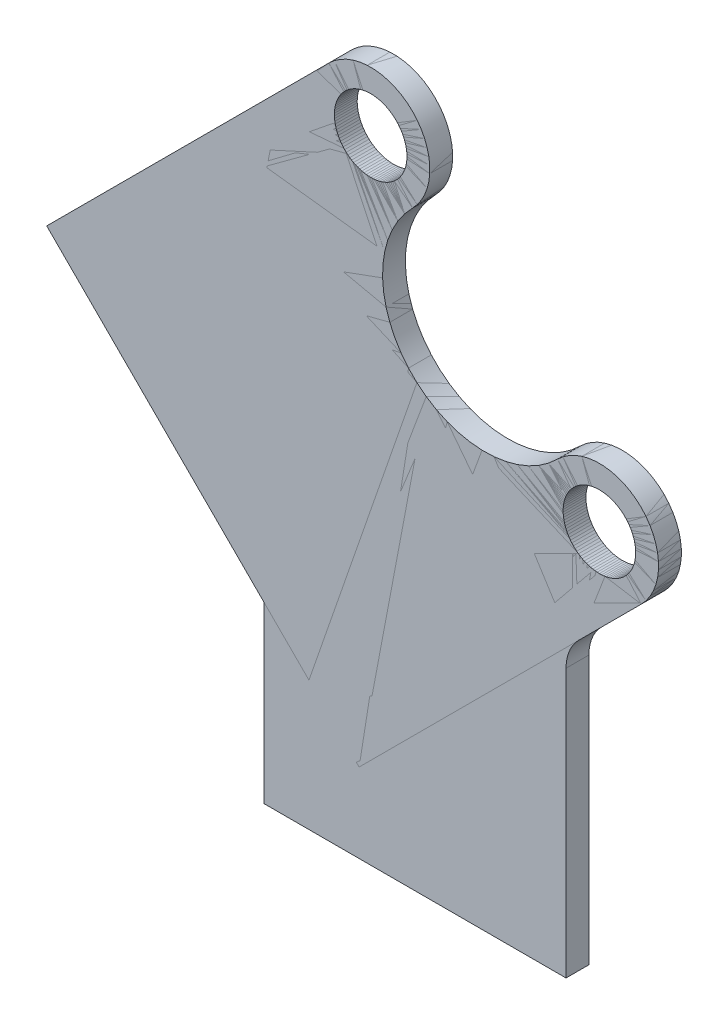
ISO-10303-21;
HEADER;
FILE_DESCRIPTION(('STEP AP214'),'2;1');
FILE_NAME('part.step','',(''),(''),'','','');
FILE_SCHEMA(('AUTOMOTIVE_DESIGN { 1 0 10303 214 1 1 1 1 }'));
ENDSEC;
DATA;
#1=APPLICATION_CONTEXT('core data for automotive mechanical design processes');
#2=APPLICATION_PROTOCOL_DEFINITION('international standard','automotive_design',2000,#1);
#3=PRODUCT_CONTEXT('',#1,'mechanical');
#4=PRODUCT('Part','Part','',(#3));
#5=PRODUCT_RELATED_PRODUCT_CATEGORY('part','',(#4));
#6=PRODUCT_DEFINITION_FORMATION('','',#4);
#7=PRODUCT_DEFINITION_CONTEXT('part definition',#1,'design');
#8=PRODUCT_DEFINITION('design','',#6,#7);
#9=PRODUCT_DEFINITION_SHAPE('','',#8);
#10=(LENGTH_UNIT() NAMED_UNIT(*) SI_UNIT(.MILLI.,.METRE.));
#11=(NAMED_UNIT(*) PLANE_ANGLE_UNIT() SI_UNIT($,.RADIAN.));
#12=(NAMED_UNIT(*) SI_UNIT($,.STERADIAN.) SOLID_ANGLE_UNIT());
#13=UNCERTAINTY_MEASURE_WITH_UNIT(LENGTH_MEASURE(1.E-05),#10,'distance_accuracy_value','');
#14=(GEOMETRIC_REPRESENTATION_CONTEXT(3) GLOBAL_UNCERTAINTY_ASSIGNED_CONTEXT((#13)) GLOBAL_UNIT_ASSIGNED_CONTEXT((#10,
#11,#12)) REPRESENTATION_CONTEXT('',''));
#15=CARTESIAN_POINT('',(0.,0.,0.));
#16=DIRECTION('',(0.,0.,1.));
#17=DIRECTION('',(1.,0.,0.));
#18=AXIS2_PLACEMENT_3D('',#15,#16,#17);
#19=CARTESIAN_POINT('',(29.0374401135023,50.8750901135023,0.));
#20=DIRECTION('',(0.,0.,1.));
#21=DIRECTION('',(1.,0.,0.));
#22=AXIS2_PLACEMENT_3D('',#19,#20,#21);
#23=PLANE('',#22);
#24=CARTESIAN_POINT('',(49.3626802270047,59.3620197729953,0.));
#25=DIRECTION('',(0.,0.,-1.));
#26=DIRECTION('',(1.,0.,0.));
#27=AXIS2_PLACEMENT_3D('',#24,#25,#26);
#28=CIRCLE('',#27,5.3467);
#29=CARTESIAN_POINT('',(54.7093802270047,59.3620197729953,0.));
#30=VERTEX_POINT('',#29);
#31=EDGE_CURVE('P0_E146',#30,#30,#28,.T.);
#32=ORIENTED_EDGE('',*,*,#31,.F.);
#33=EDGE_LOOP('',(#32));
#34=FACE_BOUND('',#33,.T.);
#35=CARTESIAN_POINT('',(15.6867197729953,93.0379802270047,0.));
#36=DIRECTION('',(0.,0.,-1.));
#37=DIRECTION('',(1.,0.,0.));
#38=AXIS2_PLACEMENT_3D('',#35,#36,#37);
#39=CIRCLE('',#38,5.3467);
#40=CARTESIAN_POINT('',(21.0334197729953,93.0379802270047,0.));
#41=VERTEX_POINT('',#40);
#42=EDGE_CURVE('P0_E147',#41,#41,#39,.T.);
#43=ORIENTED_EDGE('',*,*,#42,.F.);
#44=EDGE_LOOP('',(#43));
#45=FACE_BOUND('',#44,.T.);
#46=DIRECTION('',(-0.707106781186547,-0.707106781186547,0.));
#47=VECTOR('',#46,1.);
#48=CARTESIAN_POINT('',(55.5231359260591,53.2015640739429,0.));
#49=LINE('',#48,#47);
#50=CARTESIAN_POINT('',(55.5231359260586,53.2015640739424,0.));
#51=VERTEX_POINT('',#50);
#52=CARTESIAN_POINT('',(13.9879995839359,11.6664277318199,0.));
#53=VERTEX_POINT('',#52);
#54=EDGE_CURVE('P0_E42',#51,#53,#49,.T.);
#55=ORIENTED_EDGE('',*,*,#54,.T.);
#56=DIRECTION('',(0.707106781186545,-0.70710678118655,0.));
#57=VECTOR('',#56,1.);
#58=CARTESIAN_POINT('',(-32.0088722681802,57.6632995839363,0.));
#59=LINE('',#58,#57);
#60=CARTESIAN_POINT('',(-32.0088722681802,57.6632995839363,0.));
#61=VERTEX_POINT('',#60);
#62=EDGE_CURVE('P0_E132',#61,#53,#59,.T.);
#63=ORIENTED_EDGE('',*,*,#62,.F.);
#64=DIRECTION('',(-0.70710678118655,-0.707106781186545,0.));
#65=VECTOR('',#64,1.);
#66=CARTESIAN_POINT('',(9.5262640739417,99.1984359260579,0.));
#67=LINE('',#66,#65);
#68=CARTESIAN_POINT('',(9.5262640739417,99.1984359260579,0.));
#69=VERTEX_POINT('',#68);
#70=EDGE_CURVE('P0_E136',#69,#61,#67,.T.);
#71=ORIENTED_EDGE('',*,*,#70,.F.);
#72=CARTESIAN_POINT('',(15.6867197729953,93.0379802270047,0.));
#73=DIRECTION('',(0.,0.,1.));
#74=DIRECTION('',(1.,0.,0.));
#75=AXIS2_PLACEMENT_3D('',#72,#73,#74);
#76=CIRCLE('',#75,8.7122);
#77=CARTESIAN_POINT('',(21.8471754720488,86.8775245279512,0.));
#78=VERTEX_POINT('',#77);
#79=EDGE_CURVE('P0_E150',#78,#69,#76,.T.);
#80=ORIENTED_EDGE('',*,*,#79,.F.);
#81=DIRECTION('',(0.707106781186548,-0.707106781186547,0.));
#82=VECTOR('',#81,1.);
#83=CARTESIAN_POINT('',(15.6867197729953,93.0379802270047,0.));
#84=LINE('',#83,#82);
#85=CARTESIAN_POINT('',(21.8561557281698,86.8685442718302,0.));
#86=VERTEX_POINT('',#85);
#87=EDGE_CURVE('P0_E158',#78,#86,#84,.T.);
#88=ORIENTED_EDGE('',*,*,#87,.T.);
#89=CARTESIAN_POINT('',(32.5247,76.2,0.));
#90=DIRECTION('',(0.,0.,1.));
#91=DIRECTION('',(1.,0.,0.));
#92=AXIS2_PLACEMENT_3D('',#89,#90,#91);
#93=CIRCLE('',#92,15.0876);
#94=CARTESIAN_POINT('',(43.1932442718302,65.5314557281699,0.));
#95=VERTEX_POINT('',#94);
#96=EDGE_CURVE('P0_E153',#86,#95,#93,.T.);
#97=ORIENTED_EDGE('',*,*,#96,.T.);
#98=DIRECTION('',(0.707106781186548,-0.707106781186547,0.));
#99=VECTOR('',#98,1.);
#100=CARTESIAN_POINT('',(15.6867197729953,93.0379802270047,0.));
#101=LINE('',#100,#99);
#102=CARTESIAN_POINT('',(43.2022245279513,65.5224754720488,0.));
#103=VERTEX_POINT('',#102);
#104=EDGE_CURVE('P0_E75',#95,#103,#101,.T.);
#105=ORIENTED_EDGE('',*,*,#104,.T.);
#106=CARTESIAN_POINT('',(49.3626802270047,59.3620197729953,0.));
#107=DIRECTION('',(0.,0.,1.));
#108=DIRECTION('',(1.,0.,0.));
#109=AXIS2_PLACEMENT_3D('',#106,#107,#108);
#110=CIRCLE('',#109,8.7122);
#111=EDGE_CURVE('P0_E48',#51,#103,#110,.T.);
#112=ORIENTED_EDGE('',*,*,#111,.F.);
#113=EDGE_LOOP('',(#55,#63,#71,#80,#88,#97,#105,#112));
#114=FACE_BOUND('',#113,.T.);
#115=ADVANCED_FACE('P0_F39',(#34,#45,#114),#23,.F.);
#116=CARTESIAN_POINT('',(29.0374401135023,50.8750901135023,3.36));
#117=DIRECTION('',(0.,0.,1.));
#118=DIRECTION('',(1.,0.,0.));
#119=AXIS2_PLACEMENT_3D('',#116,#117,#118);
#120=PLANE('',#119);
#121=CARTESIAN_POINT('',(15.6867197729953,93.0379802270047,3.36));
#122=DIRECTION('',(0.,0.,-1.));
#123=DIRECTION('',(1.,0.,0.));
#124=AXIS2_PLACEMENT_3D('',#121,#122,#123);
#125=CIRCLE('',#124,5.3467);
#126=CARTESIAN_POINT('',(21.0334197729953,93.0379802270047,3.36));
#127=VERTEX_POINT('',#126);
#128=EDGE_CURVE('P0_E141',#127,#127,#125,.T.);
#129=ORIENTED_EDGE('',*,*,#128,.T.);
#130=EDGE_LOOP('',(#129));
#131=FACE_BOUND('',#130,.T.);
#132=CARTESIAN_POINT('',(49.3626802270047,59.3620197729953,3.36));
#133=DIRECTION('',(0.,0.,-1.));
#134=DIRECTION('',(1.,0.,0.));
#135=AXIS2_PLACEMENT_3D('',#132,#133,#134);
#136=CIRCLE('',#135,5.3467);
#137=CARTESIAN_POINT('',(54.7093802270047,59.3620197729953,3.36));
#138=VERTEX_POINT('',#137);
#139=EDGE_CURVE('P0_E143',#138,#138,#136,.T.);
#140=ORIENTED_EDGE('',*,*,#139,.T.);
#141=EDGE_LOOP('',(#140));
#142=FACE_BOUND('',#141,.T.);
#143=DIRECTION('',(0.707106781186545,-0.70710678118655,0.));
#144=VECTOR('',#143,1.);
#145=CARTESIAN_POINT('',(-32.0088722681802,57.6632995839363,3.36));
#146=LINE('',#145,#144);
#147=CARTESIAN_POINT('',(-32.0088722681802,57.6632995839363,3.36000000000006));
#148=VERTEX_POINT('',#147);
#149=CARTESIAN_POINT('',(13.9879995839359,11.6664277318199,3.36000000000006));
#150=VERTEX_POINT('',#149);
#151=EDGE_CURVE('P0_E108',#148,#150,#146,.T.);
#152=ORIENTED_EDGE('',*,*,#151,.T.);
#153=DIRECTION('',(0.707106781186548,0.707106781186548,0.));
#154=VECTOR('',#153,1.);
#155=CARTESIAN_POINT('',(55.5231359260581,53.2015640739419,3.36));
#156=LINE('',#155,#154);
#157=CARTESIAN_POINT('',(55.5231359260591,53.2015640739429,3.36));
#158=VERTEX_POINT('',#157);
#159=EDGE_CURVE('P0_E121',#150,#158,#156,.T.);
#160=ORIENTED_EDGE('',*,*,#159,.T.);
#161=CARTESIAN_POINT('',(49.3626802270047,59.3620197729953,3.36));
#162=DIRECTION('',(0.,0.,1.));
#163=DIRECTION('',(1.,0.,0.));
#164=AXIS2_PLACEMENT_3D('',#161,#162,#163);
#165=CIRCLE('',#164,8.7122);
#166=CARTESIAN_POINT('',(43.2022245279513,65.5224754720488,3.36));
#167=VERTEX_POINT('',#166);
#168=EDGE_CURVE('P0_E11',#158,#167,#165,.T.);
#169=ORIENTED_EDGE('',*,*,#168,.T.);
#170=DIRECTION('',(-0.707106781186548,0.707106781186547,0.));
#171=VECTOR('',#170,1.);
#172=CARTESIAN_POINT('',(15.6867197729953,93.0379802270047,3.36));
#173=LINE('',#172,#171);
#174=CARTESIAN_POINT('',(43.1932442718302,65.5314557281699,3.36));
#175=VERTEX_POINT('',#174);
#176=EDGE_CURVE('P0_E164',#167,#175,#173,.T.);
#177=ORIENTED_EDGE('',*,*,#176,.T.);
#178=CARTESIAN_POINT('',(32.5247,76.2,3.36));
#179=DIRECTION('',(0.,0.,-1.));
#180=DIRECTION('',(1.,0.,0.));
#181=AXIS2_PLACEMENT_3D('',#178,#179,#180);
#182=CIRCLE('',#181,15.0876);
#183=CARTESIAN_POINT('',(21.8561557281698,86.8685442718302,3.36));
#184=VERTEX_POINT('',#183);
#185=EDGE_CURVE('P0_E80',#175,#184,#182,.T.);
#186=ORIENTED_EDGE('',*,*,#185,.T.);
#187=DIRECTION('',(-0.707106781186548,0.707106781186547,0.));
#188=VECTOR('',#187,1.);
#189=CARTESIAN_POINT('',(15.6867197729953,93.0379802270047,3.36));
#190=LINE('',#189,#188);
#191=CARTESIAN_POINT('',(21.8471754720488,86.8775245279512,3.36));
#192=VERTEX_POINT('',#191);
#193=EDGE_CURVE('P0_E157',#184,#192,#190,.T.);
#194=ORIENTED_EDGE('',*,*,#193,.T.);
#195=CARTESIAN_POINT('',(15.6867197729953,93.0379802270047,3.36));
#196=DIRECTION('',(0.,0.,1.));
#197=DIRECTION('',(1.,0.,0.));
#198=AXIS2_PLACEMENT_3D('',#195,#196,#197);
#199=CIRCLE('',#198,8.7122);
#200=CARTESIAN_POINT('',(9.5262640739417,99.1984359260579,3.36000000000006));
#201=VERTEX_POINT('',#200);
#202=EDGE_CURVE('P0_E169',#192,#201,#199,.T.);
#203=ORIENTED_EDGE('',*,*,#202,.T.);
#204=DIRECTION('',(-0.70710678118655,-0.707106781186545,0.));
#205=VECTOR('',#204,1.);
#206=CARTESIAN_POINT('',(9.5262640739417,99.1984359260579,3.36));
#207=LINE('',#206,#205);
#208=EDGE_CURVE('P0_E100',#201,#148,#207,.T.);
#209=ORIENTED_EDGE('',*,*,#208,.T.);
#210=EDGE_LOOP('',(#152,#160,#169,#177,#186,#194,#203,#209));
#211=FACE_BOUND('',#210,.T.);
#212=ADVANCED_FACE('P0_F128',(#131,#142,#211),#120,.T.);
#213=CARTESIAN_POINT('',(49.3626802270047,59.3620197729953,0.));
#214=DIRECTION('',(0.,0.,-1.));
#215=DIRECTION('',(1.,0.,0.));
#216=AXIS2_PLACEMENT_3D('',#213,#214,#215);
#217=CYLINDRICAL_SURFACE('',#216,8.7122);
#218=ORIENTED_EDGE('',*,*,#111,.T.);
#219=DIRECTION('',(0.,0.,1.));
#220=VECTOR('',#219,1.);
#221=CARTESIAN_POINT('',(43.2022245279513,65.5224754720488,0.));
#222=LINE('',#221,#220);
#223=EDGE_CURVE('P0_E166',#103,#167,#222,.T.);
#224=ORIENTED_EDGE('',*,*,#223,.T.);
#225=ORIENTED_EDGE('',*,*,#168,.F.);
#226=DIRECTION('',(0.,0.,1.));
#227=VECTOR('',#226,1.);
#228=CARTESIAN_POINT('',(55.5231359260591,53.2015640739429,0.));
#229=LINE('',#228,#227);
#230=EDGE_CURVE('P0_E125',#51,#158,#229,.T.);
#231=ORIENTED_EDGE('',*,*,#230,.F.);
#232=EDGE_LOOP('',(#218,#224,#225,#231));
#233=FACE_BOUND('',#232,.T.);
#234=ADVANCED_FACE('P0_F196',(#233),#217,.T.);
#235=CARTESIAN_POINT('',(43.2022245279513,65.5224754720488,0.));
#236=DIRECTION('',(0.707106781186547,0.707106781186548,0.));
#237=DIRECTION('',(-0.707106781186548,0.707106781186547,0.));
#238=AXIS2_PLACEMENT_3D('',#235,#236,#237);
#239=PLANE('',#238);
#240=ORIENTED_EDGE('',*,*,#104,.F.);
#241=DIRECTION('',(0.,0.,1.));
#242=VECTOR('',#241,1.);
#243=CARTESIAN_POINT('',(43.1932442718302,65.5314557281699,0.));
#244=LINE('',#243,#242);
#245=EDGE_CURVE('P0_E152',#95,#175,#244,.T.);
#246=ORIENTED_EDGE('',*,*,#245,.T.);
#247=ORIENTED_EDGE('',*,*,#176,.F.);
#248=ORIENTED_EDGE('',*,*,#223,.F.);
#249=EDGE_LOOP('',(#240,#246,#247,#248));
#250=FACE_BOUND('',#249,.T.);
#251=ADVANCED_FACE('P0_F195',(#250),#239,.T.);
#252=CARTESIAN_POINT('',(32.5247,76.2,0.));
#253=DIRECTION('',(0.,0.,-1.));
#254=DIRECTION('',(1.,0.,0.));
#255=AXIS2_PLACEMENT_3D('',#252,#253,#254);
#256=CYLINDRICAL_SURFACE('',#255,15.0876);
#257=ORIENTED_EDGE('',*,*,#96,.F.);
#258=DIRECTION('',(0.,0.,1.));
#259=VECTOR('',#258,1.);
#260=CARTESIAN_POINT('',(21.8561557281698,86.8685442718302,0.));
#261=LINE('',#260,#259);
#262=EDGE_CURVE('P0_E155',#86,#184,#261,.T.);
#263=ORIENTED_EDGE('',*,*,#262,.T.);
#264=ORIENTED_EDGE('',*,*,#185,.F.);
#265=ORIENTED_EDGE('',*,*,#245,.F.);
#266=EDGE_LOOP('',(#257,#263,#264,#265));
#267=FACE_BOUND('',#266,.T.);
#268=ADVANCED_FACE('P0_F193',(#267),#256,.F.);
#269=CARTESIAN_POINT('',(21.8561557281698,86.8685442718302,0.));
#270=DIRECTION('',(0.707106781186547,0.707106781186548,0.));
#271=DIRECTION('',(-0.707106781186548,0.707106781186547,0.));
#272=AXIS2_PLACEMENT_3D('',#269,#270,#271);
#273=PLANE('',#272);
#274=ORIENTED_EDGE('',*,*,#87,.F.);
#275=DIRECTION('',(0.,0.,1.));
#276=VECTOR('',#275,1.);
#277=CARTESIAN_POINT('',(21.8471754720488,86.8775245279512,0.));
#278=LINE('',#277,#276);
#279=EDGE_CURVE('P0_E161',#78,#192,#278,.T.);
#280=ORIENTED_EDGE('',*,*,#279,.T.);
#281=ORIENTED_EDGE('',*,*,#193,.F.);
#282=ORIENTED_EDGE('',*,*,#262,.F.);
#283=EDGE_LOOP('',(#274,#280,#281,#282));
#284=FACE_BOUND('',#283,.T.);
#285=ADVANCED_FACE('P0_F190',(#284),#273,.T.);
#286=CARTESIAN_POINT('',(15.6867197729953,93.0379802270047,0.));
#287=DIRECTION('',(0.,0.,-1.));
#288=DIRECTION('',(1.,0.,0.));
#289=AXIS2_PLACEMENT_3D('',#286,#287,#288);
#290=CYLINDRICAL_SURFACE('',#289,8.7122);
#291=ORIENTED_EDGE('',*,*,#79,.T.);
#292=DIRECTION('',(0.,0.,1.));
#293=VECTOR('',#292,1.);
#294=CARTESIAN_POINT('',(9.52626407394174,99.1984359260579,0.));
#295=LINE('',#294,#293);
#296=EDGE_CURVE('P0_E126',#69,#201,#295,.T.);
#297=ORIENTED_EDGE('',*,*,#296,.T.);
#298=ORIENTED_EDGE('',*,*,#202,.F.);
#299=ORIENTED_EDGE('',*,*,#279,.F.);
#300=EDGE_LOOP('',(#291,#297,#298,#299));
#301=FACE_BOUND('',#300,.T.);
#302=ADVANCED_FACE('P0_F186',(#301),#290,.T.);
#303=CARTESIAN_POINT('',(46.3098719394654,43.9883000873493,0.));
#304=DIRECTION('',(0.707106781186548,-0.707106781186548,0.));
#305=DIRECTION('',(0.707106781186548,0.707106781186548,0.));
#306=AXIS2_PLACEMENT_3D('',#303,#304,#305);
#307=PLANE('',#306);
#308=ORIENTED_EDGE('',*,*,#54,.F.);
#309=ORIENTED_EDGE('',*,*,#230,.T.);
#310=ORIENTED_EDGE('',*,*,#159,.F.);
#311=DIRECTION('',(0.,0.,-1.));
#312=VECTOR('',#311,1.);
#313=CARTESIAN_POINT('',(13.9879995839359,11.6664277318199,3.36000000000006));
#314=LINE('',#313,#312);
#315=EDGE_CURVE('P0_E124',#150,#53,#314,.T.);
#316=ORIENTED_EDGE('',*,*,#315,.T.);
#317=EDGE_LOOP('',(#308,#309,#310,#316));
#318=FACE_BOUND('',#317,.T.);
#319=ADVANCED_FACE('P0_F123',(#318),#307,.T.);
#320=CARTESIAN_POINT('',(49.3626802270047,59.3620197729953,0.));
#321=DIRECTION('',(0.,0.,-1.));
#322=DIRECTION('',(1.,0.,0.));
#323=AXIS2_PLACEMENT_3D('',#320,#321,#322);
#324=CYLINDRICAL_SURFACE('',#323,5.3467);
#325=ORIENTED_EDGE('',*,*,#31,.T.);
#326=EDGE_LOOP('',(#325));
#327=FACE_BOUND('',#326,.T.);
#328=ORIENTED_EDGE('',*,*,#139,.F.);
#329=EDGE_LOOP('',(#328));
#330=FACE_BOUND('',#329,.T.);
#331=ADVANCED_FACE('P0_F218',(#327,#330),#324,.F.);
#332=CARTESIAN_POINT('',(15.6867197729953,93.0379802270047,0.));
#333=DIRECTION('',(0.,0.,-1.));
#334=DIRECTION('',(1.,0.,0.));
#335=AXIS2_PLACEMENT_3D('',#332,#333,#334);
#336=CYLINDRICAL_SURFACE('',#335,5.3467);
#337=ORIENTED_EDGE('',*,*,#42,.T.);
#338=EDGE_LOOP('',(#337));
#339=FACE_BOUND('',#338,.T.);
#340=ORIENTED_EDGE('',*,*,#128,.F.);
#341=EDGE_LOOP('',(#340));
#342=FACE_BOUND('',#341,.T.);
#343=ADVANCED_FACE('P0_F215',(#339,#342),#336,.F.);
#344=CARTESIAN_POINT('',(-32.0088722681802,57.6632995839363,130.757664528152));
#345=DIRECTION('',(0.70710678118655,0.707106781186545,0.));
#346=DIRECTION('',(-0.707106781186545,0.70710678118655,0.));
#347=AXIS2_PLACEMENT_3D('',#344,#345,#346);
#348=PLANE('',#347);
#349=ORIENTED_EDGE('',*,*,#62,.T.);
#350=ORIENTED_EDGE('',*,*,#315,.F.);
#351=ORIENTED_EDGE('',*,*,#151,.F.);
#352=DIRECTION('',(0.,0.,-1.));
#353=VECTOR('',#352,1.);
#354=CARTESIAN_POINT('',(-32.0088722681802,57.6632995839363,130.757664528152));
#355=LINE('',#354,#353);
#356=EDGE_CURVE('P0_E140',#148,#61,#355,.T.);
#357=ORIENTED_EDGE('',*,*,#356,.T.);
#358=EDGE_LOOP('',(#349,#350,#351,#357));
#359=FACE_BOUND('',#358,.T.);
#360=ADVANCED_FACE('P0_F130',(#359),#348,.F.);
#361=CARTESIAN_POINT('',(9.5262640739417,99.1984359260579,130.757664528152));
#362=DIRECTION('',(0.707106781186545,-0.70710678118655,0.));
#363=DIRECTION('',(0.70710678118655,0.707106781186545,0.));
#364=AXIS2_PLACEMENT_3D('',#361,#362,#363);
#365=PLANE('',#364);
#366=ORIENTED_EDGE('',*,*,#208,.F.);
#367=ORIENTED_EDGE('',*,*,#296,.F.);
#368=ORIENTED_EDGE('',*,*,#70,.T.);
#369=ORIENTED_EDGE('',*,*,#356,.F.);
#370=EDGE_LOOP('',(#366,#367,#368,#369));
#371=FACE_BOUND('',#370,.T.);
#372=ADVANCED_FACE('P0_F265',(#371),#365,.F.);
#373=CLOSED_SHELL('',(#115,#212,#234,#251,#268,#285,#302,#319,#331,#343,#360,#372));
#374=MANIFOLD_SOLID_BREP('P0_B2',#373);
#375=CARTESIAN_POINT('',(29.0374401135023,50.8750901135023,0.));
#376=DIRECTION('',(0.,0.,1.));
#377=DIRECTION('',(1.,0.,0.));
#378=AXIS2_PLACEMENT_3D('',#375,#376,#377);
#379=PLANE('',#378);
#380=CARTESIAN_POINT('',(49.3626802270047,59.3620197729953,0.));
#381=DIRECTION('',(0.,0.,1.));
#382=DIRECTION('',(1.,0.,0.));
#383=AXIS2_PLACEMENT_3D('',#380,#381,#382);
#384=CIRCLE('',#383,8.7122);
#385=CARTESIAN_POINT('',(55.5231359260591,53.2015640739429,0.));
#386=VERTEX_POINT('',#385);
#387=CARTESIAN_POINT('',(43.2022245279513,65.5224754720488,0.));
#388=VERTEX_POINT('',#387);
#389=EDGE_CURVE('P1_E27',#386,#388,#384,.T.);
#390=ORIENTED_EDGE('',*,*,#389,.F.);
#391=DIRECTION('',(-0.707106781186548,-0.707106781186548,0.));
#392=VECTOR('',#391,1.);
#393=CARTESIAN_POINT('',(55.5231359260581,53.2015640739419,0.));
#394=LINE('',#393,#392);
#395=CARTESIAN_POINT('',(46.3098719394654,43.9883000873493,0.));
#396=VERTEX_POINT('',#395);
#397=EDGE_CURVE('P1_E147',#386,#396,#394,.T.);
#398=ORIENTED_EDGE('',*,*,#397,.T.);
#399=CARTESIAN_POINT('',(50.8,39.4981720268146,0.));
#400=DIRECTION('',(0.,0.,1.));
#401=DIRECTION('',(-0.70710678118655,0.707106781186545,0.));
#402=AXIS2_PLACEMENT_3D('',#399,#400,#401);
#403=CIRCLE('',#402,6.3500000000001);
#404=CARTESIAN_POINT('',(44.45,39.4981720268146,0.));
#405=VERTEX_POINT('',#404);
#406=EDGE_CURVE('P1_E167',#396,#405,#403,.T.);
#407=ORIENTED_EDGE('',*,*,#406,.T.);
#408=DIRECTION('',(0.,-1.,0.));
#409=VECTOR('',#408,1.);
#410=CARTESIAN_POINT('',(44.45,39.4981720268146,0.));
#411=LINE('',#410,#409);
#412=CARTESIAN_POINT('',(44.45,0.,0.));
#413=VERTEX_POINT('',#412);
#414=EDGE_CURVE('P1_E110',#405,#413,#411,.T.);
#415=ORIENTED_EDGE('',*,*,#414,.T.);
#416=DIRECTION('',(1.,0.,0.));
#417=VECTOR('',#416,1.);
#418=CARTESIAN_POINT('',(0.,0.,0.));
#419=LINE('',#418,#417);
#420=CARTESIAN_POINT('',(0.,0.,0.));
#421=VERTEX_POINT('',#420);
#422=EDGE_CURVE('P1_E133',#421,#413,#419,.T.);
#423=ORIENTED_EDGE('',*,*,#422,.F.);
#424=DIRECTION('',(0.,1.,0.));
#425=VECTOR('',#424,1.);
#426=CARTESIAN_POINT('',(0.,0.,0.));
#427=LINE('',#426,#425);
#428=CARTESIAN_POINT('',(0.,76.2,0.));
#429=VERTEX_POINT('',#428);
#430=EDGE_CURVE('P1_E141',#421,#429,#427,.T.);
#431=ORIENTED_EDGE('',*,*,#430,.T.);
#432=CARTESIAN_POINT('',(32.5247,76.2,0.));
#433=DIRECTION('',(0.,0.,1.));
#434=DIRECTION('',(1.,0.,0.));
#435=AXIS2_PLACEMENT_3D('',#432,#433,#434);
#436=CIRCLE('',#435,32.5247);
#437=CARTESIAN_POINT('',(9.52626407394174,99.1984359260579,0.));
#438=VERTEX_POINT('',#437);
#439=EDGE_CURVE('P1_E179',#438,#429,#436,.T.);
#440=ORIENTED_EDGE('',*,*,#439,.F.);
#441=CARTESIAN_POINT('',(15.6867197729953,93.0379802270047,0.));
#442=DIRECTION('',(0.,0.,1.));
#443=DIRECTION('',(1.,0.,0.));
#444=AXIS2_PLACEMENT_3D('',#441,#442,#443);
#445=CIRCLE('',#444,8.7122);
#446=CARTESIAN_POINT('',(21.8471754720488,86.8775245279512,0.));
#447=VERTEX_POINT('',#446);
#448=EDGE_CURVE('P1_E81',#447,#438,#445,.T.);
#449=ORIENTED_EDGE('',*,*,#448,.F.);
#450=DIRECTION('',(0.707106781186548,-0.707106781186547,0.));
#451=VECTOR('',#450,1.);
#452=CARTESIAN_POINT('',(15.6867197729953,93.0379802270047,0.));
#453=LINE('',#452,#451);
#454=CARTESIAN_POINT('',(21.8561557281698,86.8685442718302,0.));
#455=VERTEX_POINT('',#454);
#456=EDGE_CURVE('P1_E145',#447,#455,#453,.T.);
#457=ORIENTED_EDGE('',*,*,#456,.T.);
#458=CARTESIAN_POINT('',(32.5247,76.2,0.));
#459=DIRECTION('',(0.,0.,1.));
#460=DIRECTION('',(1.,0.,0.));
#461=AXIS2_PLACEMENT_3D('',#458,#459,#460);
#462=CIRCLE('',#461,15.0876);
#463=CARTESIAN_POINT('',(43.1932442718302,65.5314557281699,0.));
#464=VERTEX_POINT('',#463);
#465=EDGE_CURVE('P1_E168',#455,#464,#462,.T.);
#466=ORIENTED_EDGE('',*,*,#465,.T.);
#467=DIRECTION('',(0.707106781186548,-0.707106781186547,0.));
#468=VECTOR('',#467,1.);
#469=CARTESIAN_POINT('',(15.6867197729953,93.0379802270047,0.));
#470=LINE('',#469,#468);
#471=EDGE_CURVE('P1_E137',#464,#388,#470,.T.);
#472=ORIENTED_EDGE('',*,*,#471,.T.);
#473=EDGE_LOOP('',(#390,#398,#407,#415,#423,#431,#440,#449,#457,#466,#472));
#474=FACE_BOUND('',#473,.T.);
#475=CARTESIAN_POINT('',(15.6867197729953,93.0379802270047,0.));
#476=DIRECTION('',(0.,0.,-1.));
#477=DIRECTION('',(1.,0.,0.));
#478=AXIS2_PLACEMENT_3D('',#475,#476,#477);
#479=CIRCLE('',#478,5.3467);
#480=CARTESIAN_POINT('',(10.3400197729953,93.0379802270047,0.));
#481=VERTEX_POINT('',#480);
#482=EDGE_CURVE('P1_E127',#481,#481,#479,.T.);
#483=ORIENTED_EDGE('',*,*,#482,.F.);
#484=EDGE_LOOP('',(#483));
#485=FACE_BOUND('',#484,.T.);
#486=CARTESIAN_POINT('',(49.3626802270047,59.3620197729953,0.));
#487=DIRECTION('',(0.,0.,-1.));
#488=DIRECTION('',(1.,0.,0.));
#489=AXIS2_PLACEMENT_3D('',#486,#487,#488);
#490=CIRCLE('',#489,5.3467);
#491=CARTESIAN_POINT('',(44.0159802270047,59.3620197729953,0.));
#492=VERTEX_POINT('',#491);
#493=EDGE_CURVE('P1_E151',#492,#492,#490,.T.);
#494=ORIENTED_EDGE('',*,*,#493,.F.);
#495=EDGE_LOOP('',(#494));
#496=FACE_BOUND('',#495,.T.);
#497=ADVANCED_FACE('P1_F17',(#474,#485,#496),#379,.F.);
#498=CARTESIAN_POINT('',(29.0374401135023,50.8750901135023,3.36));
#499=DIRECTION('',(0.,0.,1.));
#500=DIRECTION('',(1.,0.,0.));
#501=AXIS2_PLACEMENT_3D('',#498,#499,#500);
#502=PLANE('',#501);
#503=CARTESIAN_POINT('',(49.3626802270047,59.3620197729953,3.36));
#504=DIRECTION('',(0.,0.,1.));
#505=DIRECTION('',(1.,0.,0.));
#506=AXIS2_PLACEMENT_3D('',#503,#504,#505);
#507=CIRCLE('',#506,8.7122);
#508=CARTESIAN_POINT('',(55.5231359260591,53.2015640739429,3.36));
#509=VERTEX_POINT('',#508);
#510=CARTESIAN_POINT('',(43.2022245279513,65.5224754720488,3.36));
#511=VERTEX_POINT('',#510);
#512=EDGE_CURVE('P1_E11',#509,#511,#507,.T.);
#513=ORIENTED_EDGE('',*,*,#512,.T.);
#514=DIRECTION('',(-0.707106781186548,0.707106781186547,0.));
#515=VECTOR('',#514,1.);
#516=CARTESIAN_POINT('',(15.6867197729953,93.0379802270047,3.36));
#517=LINE('',#516,#515);
#518=CARTESIAN_POINT('',(43.1932442718302,65.5314557281699,3.36));
#519=VERTEX_POINT('',#518);
#520=EDGE_CURVE('P1_E135',#511,#519,#517,.T.);
#521=ORIENTED_EDGE('',*,*,#520,.T.);
#522=CARTESIAN_POINT('',(32.5247,76.2,3.36));
#523=DIRECTION('',(0.,0.,-1.));
#524=DIRECTION('',(1.,0.,0.));
#525=AXIS2_PLACEMENT_3D('',#522,#523,#524);
#526=CIRCLE('',#525,15.0876);
#527=CARTESIAN_POINT('',(21.8561557281698,86.8685442718302,3.36));
#528=VERTEX_POINT('',#527);
#529=EDGE_CURVE('P1_E171',#519,#528,#526,.T.);
#530=ORIENTED_EDGE('',*,*,#529,.T.);
#531=DIRECTION('',(-0.707106781186548,0.707106781186547,0.));
#532=VECTOR('',#531,1.);
#533=CARTESIAN_POINT('',(15.6867197729953,93.0379802270047,3.36));
#534=LINE('',#533,#532);
#535=CARTESIAN_POINT('',(21.8471754720488,86.8775245279512,3.36));
#536=VERTEX_POINT('',#535);
#537=EDGE_CURVE('P1_E155',#528,#536,#534,.T.);
#538=ORIENTED_EDGE('',*,*,#537,.T.);
#539=CARTESIAN_POINT('',(15.6867197729953,93.0379802270047,3.36));
#540=DIRECTION('',(0.,0.,1.));
#541=DIRECTION('',(1.,0.,0.));
#542=AXIS2_PLACEMENT_3D('',#539,#540,#541);
#543=CIRCLE('',#542,8.7122);
#544=CARTESIAN_POINT('',(9.52626407394174,99.1984359260579,3.36));
#545=VERTEX_POINT('',#544);
#546=EDGE_CURVE('P1_E146',#536,#545,#543,.T.);
#547=ORIENTED_EDGE('',*,*,#546,.T.);
#548=CARTESIAN_POINT('',(32.5247,76.2,3.36));
#549=DIRECTION('',(0.,0.,1.));
#550=DIRECTION('',(1.,0.,0.));
#551=AXIS2_PLACEMENT_3D('',#548,#549,#550);
#552=CIRCLE('',#551,32.5247);
#553=CARTESIAN_POINT('',(0.,76.2,3.36));
#554=VERTEX_POINT('',#553);
#555=EDGE_CURVE('P1_E90',#545,#554,#552,.T.);
#556=ORIENTED_EDGE('',*,*,#555,.T.);
#557=DIRECTION('',(0.,-1.,0.));
#558=VECTOR('',#557,1.);
#559=CARTESIAN_POINT('',(0.,0.,3.36));
#560=LINE('',#559,#558);
#561=CARTESIAN_POINT('',(0.,0.,3.36));
#562=VERTEX_POINT('',#561);
#563=EDGE_CURVE('P1_E138',#554,#562,#560,.T.);
#564=ORIENTED_EDGE('',*,*,#563,.T.);
#565=DIRECTION('',(1.,0.,0.));
#566=VECTOR('',#565,1.);
#567=CARTESIAN_POINT('',(0.,0.,3.36));
#568=LINE('',#567,#566);
#569=CARTESIAN_POINT('',(44.45,0.,3.36));
#570=VERTEX_POINT('',#569);
#571=EDGE_CURVE('P1_E175',#562,#570,#568,.T.);
#572=ORIENTED_EDGE('',*,*,#571,.T.);
#573=DIRECTION('',(0.,1.,0.));
#574=VECTOR('',#573,1.);
#575=CARTESIAN_POINT('',(44.45,39.4981720268146,3.36));
#576=LINE('',#575,#574);
#577=CARTESIAN_POINT('',(44.45,39.4981720268146,3.36));
#578=VERTEX_POINT('',#577);
#579=EDGE_CURVE('P1_E161',#570,#578,#576,.T.);
#580=ORIENTED_EDGE('',*,*,#579,.T.);
#581=CARTESIAN_POINT('',(50.8,39.4981720268146,3.36));
#582=DIRECTION('',(0.,0.,-1.));
#583=DIRECTION('',(-0.70710678118655,0.707106781186545,0.));
#584=AXIS2_PLACEMENT_3D('',#581,#582,#583);
#585=CIRCLE('',#584,6.3500000000001);
#586=CARTESIAN_POINT('',(46.3098719394654,43.9883000873493,3.36));
#587=VERTEX_POINT('',#586);
#588=EDGE_CURVE('P1_E115',#578,#587,#585,.T.);
#589=ORIENTED_EDGE('',*,*,#588,.T.);
#590=DIRECTION('',(0.707106781186548,0.707106781186548,0.));
#591=VECTOR('',#590,1.);
#592=CARTESIAN_POINT('',(55.5231359260581,53.2015640739419,3.36));
#593=LINE('',#592,#591);
#594=EDGE_CURVE('P1_E153',#587,#509,#593,.T.);
#595=ORIENTED_EDGE('',*,*,#594,.T.);
#596=EDGE_LOOP('',(#513,#521,#530,#538,#547,#556,#564,#572,#580,#589,#595));
#597=FACE_BOUND('',#596,.T.);
#598=CARTESIAN_POINT('',(15.6867197729953,93.0379802270047,3.36));
#599=DIRECTION('',(0.,0.,-1.));
#600=DIRECTION('',(1.,0.,0.));
#601=AXIS2_PLACEMENT_3D('',#598,#599,#600);
#602=CIRCLE('',#601,5.3467);
#603=CARTESIAN_POINT('',(10.3400197729953,93.0379802270047,3.36));
#604=VERTEX_POINT('',#603);
#605=EDGE_CURVE('P1_E123',#604,#604,#602,.T.);
#606=ORIENTED_EDGE('',*,*,#605,.T.);
#607=EDGE_LOOP('',(#606));
#608=FACE_BOUND('',#607,.T.);
#609=CARTESIAN_POINT('',(49.3626802270047,59.3620197729953,3.36));
#610=DIRECTION('',(0.,0.,-1.));
#611=DIRECTION('',(1.,0.,0.));
#612=AXIS2_PLACEMENT_3D('',#609,#610,#611);
#613=CIRCLE('',#612,5.3467);
#614=CARTESIAN_POINT('',(44.0159802270047,59.3620197729953,3.36));
#615=VERTEX_POINT('',#614);
#616=EDGE_CURVE('P1_E129',#615,#615,#613,.T.);
#617=ORIENTED_EDGE('',*,*,#616,.T.);
#618=EDGE_LOOP('',(#617));
#619=FACE_BOUND('',#618,.T.);
#620=ADVANCED_FACE('P1_F124',(#597,#608,#619),#502,.T.);
#621=CARTESIAN_POINT('',(49.3626802270047,59.3620197729953,0.));
#622=DIRECTION('',(0.,0.,-1.));
#623=DIRECTION('',(1.,0.,0.));
#624=AXIS2_PLACEMENT_3D('',#621,#622,#623);
#625=CYLINDRICAL_SURFACE('',#624,8.7122);
#626=ORIENTED_EDGE('',*,*,#389,.T.);
#627=DIRECTION('',(0.,0.,1.));
#628=VECTOR('',#627,1.);
#629=CARTESIAN_POINT('',(43.2022245279513,65.5224754720488,0.));
#630=LINE('',#629,#628);
#631=EDGE_CURVE('P1_E21',#388,#511,#630,.T.);
#632=ORIENTED_EDGE('',*,*,#631,.T.);
#633=ORIENTED_EDGE('',*,*,#512,.F.);
#634=DIRECTION('',(0.,0.,1.));
#635=VECTOR('',#634,1.);
#636=CARTESIAN_POINT('',(55.5231359260591,53.2015640739429,0.));
#637=LINE('',#636,#635);
#638=EDGE_CURVE('P1_E150',#386,#509,#637,.T.);
#639=ORIENTED_EDGE('',*,*,#638,.F.);
#640=EDGE_LOOP('',(#626,#632,#633,#639));
#641=FACE_BOUND('',#640,.T.);
#642=ADVANCED_FACE('P1_F230',(#641),#625,.T.);
#643=CARTESIAN_POINT('',(43.2022245279513,65.5224754720488,0.));
#644=DIRECTION('',(0.707106781186547,0.707106781186548,0.));
#645=DIRECTION('',(-0.707106781186548,0.707106781186547,0.));
#646=AXIS2_PLACEMENT_3D('',#643,#644,#645);
#647=PLANE('',#646);
#648=ORIENTED_EDGE('',*,*,#471,.F.);
#649=DIRECTION('',(0.,0.,1.));
#650=VECTOR('',#649,1.);
#651=CARTESIAN_POINT('',(43.1932442718302,65.5314557281699,0.));
#652=LINE('',#651,#650);
#653=EDGE_CURVE('P1_E183',#464,#519,#652,.T.);
#654=ORIENTED_EDGE('',*,*,#653,.T.);
#655=ORIENTED_EDGE('',*,*,#520,.F.);
#656=ORIENTED_EDGE('',*,*,#631,.F.);
#657=EDGE_LOOP('',(#648,#654,#655,#656));
#658=FACE_BOUND('',#657,.T.);
#659=ADVANCED_FACE('P1_F225',(#658),#647,.T.);
#660=CARTESIAN_POINT('',(32.5247,76.2,0.));
#661=DIRECTION('',(0.,0.,-1.));
#662=DIRECTION('',(1.,0.,0.));
#663=AXIS2_PLACEMENT_3D('',#660,#661,#662);
#664=CYLINDRICAL_SURFACE('',#663,15.0876);
#665=ORIENTED_EDGE('',*,*,#465,.F.);
#666=DIRECTION('',(0.,0.,1.));
#667=VECTOR('',#666,1.);
#668=CARTESIAN_POINT('',(21.8561557281698,86.8685442718302,0.));
#669=LINE('',#668,#667);
#670=EDGE_CURVE('P1_E157',#455,#528,#669,.T.);
#671=ORIENTED_EDGE('',*,*,#670,.T.);
#672=ORIENTED_EDGE('',*,*,#529,.F.);
#673=ORIENTED_EDGE('',*,*,#653,.F.);
#674=EDGE_LOOP('',(#665,#671,#672,#673));
#675=FACE_BOUND('',#674,.T.);
#676=ADVANCED_FACE('P1_F222',(#675),#664,.F.);
#677=CARTESIAN_POINT('',(21.8561557281698,86.8685442718302,0.));
#678=DIRECTION('',(0.707106781186547,0.707106781186548,0.));
#679=DIRECTION('',(-0.707106781186548,0.707106781186547,0.));
#680=AXIS2_PLACEMENT_3D('',#677,#678,#679);
#681=PLANE('',#680);
#682=ORIENTED_EDGE('',*,*,#456,.F.);
#683=DIRECTION('',(0.,0.,1.));
#684=VECTOR('',#683,1.);
#685=CARTESIAN_POINT('',(21.8471754720488,86.8775245279512,0.));
#686=LINE('',#685,#684);
#687=EDGE_CURVE('P1_E142',#447,#536,#686,.T.);
#688=ORIENTED_EDGE('',*,*,#687,.T.);
#689=ORIENTED_EDGE('',*,*,#537,.F.);
#690=ORIENTED_EDGE('',*,*,#670,.F.);
#691=EDGE_LOOP('',(#682,#688,#689,#690));
#692=FACE_BOUND('',#691,.T.);
#693=ADVANCED_FACE('P1_F213',(#692),#681,.T.);
#694=CARTESIAN_POINT('',(15.6867197729953,93.0379802270047,0.));
#695=DIRECTION('',(0.,0.,-1.));
#696=DIRECTION('',(1.,0.,0.));
#697=AXIS2_PLACEMENT_3D('',#694,#695,#696);
#698=CYLINDRICAL_SURFACE('',#697,8.7122);
#699=ORIENTED_EDGE('',*,*,#448,.T.);
#700=DIRECTION('',(0.,0.,1.));
#701=VECTOR('',#700,1.);
#702=CARTESIAN_POINT('',(9.52626407394174,99.1984359260579,0.));
#703=LINE('',#702,#701);
#704=EDGE_CURVE('P1_E164',#438,#545,#703,.T.);
#705=ORIENTED_EDGE('',*,*,#704,.T.);
#706=ORIENTED_EDGE('',*,*,#546,.F.);
#707=ORIENTED_EDGE('',*,*,#687,.F.);
#708=EDGE_LOOP('',(#699,#705,#706,#707));
#709=FACE_BOUND('',#708,.T.);
#710=ADVANCED_FACE('P1_F216',(#709),#698,.T.);
#711=CARTESIAN_POINT('',(32.5247,76.2,0.));
#712=DIRECTION('',(0.,0.,-1.));
#713=DIRECTION('',(1.,0.,0.));
#714=AXIS2_PLACEMENT_3D('',#711,#712,#713);
#715=CYLINDRICAL_SURFACE('',#714,32.5247);
#716=ORIENTED_EDGE('',*,*,#439,.T.);
#717=DIRECTION('',(0.,0.,1.));
#718=VECTOR('',#717,1.);
#719=CARTESIAN_POINT('',(0.,76.2,0.));
#720=LINE('',#719,#718);
#721=EDGE_CURVE('P1_E140',#429,#554,#720,.T.);
#722=ORIENTED_EDGE('',*,*,#721,.T.);
#723=ORIENTED_EDGE('',*,*,#555,.F.);
#724=ORIENTED_EDGE('',*,*,#704,.F.);
#725=EDGE_LOOP('',(#716,#722,#723,#724));
#726=FACE_BOUND('',#725,.T.);
#727=ADVANCED_FACE('P1_F261',(#726),#715,.T.);
#728=CARTESIAN_POINT('',(0.,76.2,0.));
#729=DIRECTION('',(-1.,0.,0.));
#730=DIRECTION('',(0.,-1.,0.));
#731=AXIS2_PLACEMENT_3D('',#728,#729,#730);
#732=PLANE('',#731);
#733=ORIENTED_EDGE('',*,*,#430,.F.);
#734=DIRECTION('',(0.,0.,1.));
#735=VECTOR('',#734,1.);
#736=CARTESIAN_POINT('',(0.,0.,0.));
#737=LINE('',#736,#735);
#738=EDGE_CURVE('P1_E172',#421,#562,#737,.T.);
#739=ORIENTED_EDGE('',*,*,#738,.T.);
#740=ORIENTED_EDGE('',*,*,#563,.F.);
#741=ORIENTED_EDGE('',*,*,#721,.F.);
#742=EDGE_LOOP('',(#733,#739,#740,#741));
#743=FACE_BOUND('',#742,.T.);
#744=ADVANCED_FACE('P1_F194',(#743),#732,.T.);
#745=CARTESIAN_POINT('',(0.,0.,0.));
#746=DIRECTION('',(0.,-1.,0.));
#747=DIRECTION('',(1.,0.,0.));
#748=AXIS2_PLACEMENT_3D('',#745,#746,#747);
#749=PLANE('',#748);
#750=ORIENTED_EDGE('',*,*,#422,.T.);
#751=DIRECTION('',(0.,0.,1.));
#752=VECTOR('',#751,1.);
#753=CARTESIAN_POINT('',(44.45,0.,0.));
#754=LINE('',#753,#752);
#755=EDGE_CURVE('P1_E158',#413,#570,#754,.T.);
#756=ORIENTED_EDGE('',*,*,#755,.T.);
#757=ORIENTED_EDGE('',*,*,#571,.F.);
#758=ORIENTED_EDGE('',*,*,#738,.F.);
#759=EDGE_LOOP('',(#750,#756,#757,#758));
#760=FACE_BOUND('',#759,.T.);
#761=ADVANCED_FACE('P1_F19',(#760),#749,.T.);
#762=CARTESIAN_POINT('',(44.45,0.,0.));
#763=DIRECTION('',(1.,0.,0.));
#764=DIRECTION('',(0.,1.,0.));
#765=AXIS2_PLACEMENT_3D('',#762,#763,#764);
#766=PLANE('',#765);
#767=ORIENTED_EDGE('',*,*,#414,.F.);
#768=DIRECTION('',(0.,0.,1.));
#769=VECTOR('',#768,1.);
#770=CARTESIAN_POINT('',(44.45,39.4981720268146,0.));
#771=LINE('',#770,#769);
#772=EDGE_CURVE('P1_E178',#405,#578,#771,.T.);
#773=ORIENTED_EDGE('',*,*,#772,.T.);
#774=ORIENTED_EDGE('',*,*,#579,.F.);
#775=ORIENTED_EDGE('',*,*,#755,.F.);
#776=EDGE_LOOP('',(#767,#773,#774,#775));
#777=FACE_BOUND('',#776,.T.);
#778=ADVANCED_FACE('P1_F240',(#777),#766,.T.);
#779=CARTESIAN_POINT('',(50.8,39.4981720268146,0.));
#780=DIRECTION('',(0.,0.,-1.));
#781=DIRECTION('',(-0.70710678118655,0.707106781186545,0.));
#782=AXIS2_PLACEMENT_3D('',#779,#780,#781);
#783=CYLINDRICAL_SURFACE('',#782,6.3500000000001);
#784=ORIENTED_EDGE('',*,*,#406,.F.);
#785=DIRECTION('',(0.,0.,1.));
#786=VECTOR('',#785,1.);
#787=CARTESIAN_POINT('',(46.3098719394654,43.9883000873493,0.));
#788=LINE('',#787,#786);
#789=EDGE_CURVE('P1_E165',#396,#587,#788,.T.);
#790=ORIENTED_EDGE('',*,*,#789,.T.);
#791=ORIENTED_EDGE('',*,*,#588,.F.);
#792=ORIENTED_EDGE('',*,*,#772,.F.);
#793=EDGE_LOOP('',(#784,#790,#791,#792));
#794=FACE_BOUND('',#793,.T.);
#795=ADVANCED_FACE('P1_F236',(#794),#783,.F.);
#796=CARTESIAN_POINT('',(46.3098719394654,43.9883000873493,0.));
#797=DIRECTION('',(0.707106781186548,-0.707106781186548,0.));
#798=DIRECTION('',(0.707106781186548,0.707106781186548,0.));
#799=AXIS2_PLACEMENT_3D('',#796,#797,#798);
#800=PLANE('',#799);
#801=ORIENTED_EDGE('',*,*,#397,.F.);
#802=ORIENTED_EDGE('',*,*,#638,.T.);
#803=ORIENTED_EDGE('',*,*,#594,.F.);
#804=ORIENTED_EDGE('',*,*,#789,.F.);
#805=EDGE_LOOP('',(#801,#802,#803,#804));
#806=FACE_BOUND('',#805,.T.);
#807=ADVANCED_FACE('P1_F234',(#806),#800,.T.);
#808=CARTESIAN_POINT('',(49.3626802270047,59.3620197729953,0.));
#809=DIRECTION('',(0.,0.,-1.));
#810=DIRECTION('',(1.,0.,0.));
#811=AXIS2_PLACEMENT_3D('',#808,#809,#810);
#812=CYLINDRICAL_SURFACE('',#811,5.3467);
#813=ORIENTED_EDGE('',*,*,#493,.T.);
#814=EDGE_LOOP('',(#813));
#815=FACE_BOUND('',#814,.T.);
#816=ORIENTED_EDGE('',*,*,#616,.F.);
#817=EDGE_LOOP('',(#816));
#818=FACE_BOUND('',#817,.T.);
#819=ADVANCED_FACE('P1_F260',(#815,#818),#812,.F.);
#820=CARTESIAN_POINT('',(15.6867197729953,93.0379802270047,0.));
#821=DIRECTION('',(0.,0.,-1.));
#822=DIRECTION('',(1.,0.,0.));
#823=AXIS2_PLACEMENT_3D('',#820,#821,#822);
#824=CYLINDRICAL_SURFACE('',#823,5.3467);
#825=ORIENTED_EDGE('',*,*,#482,.T.);
#826=EDGE_LOOP('',(#825));
#827=FACE_BOUND('',#826,.T.);
#828=ORIENTED_EDGE('',*,*,#605,.F.);
#829=EDGE_LOOP('',(#828));
#830=FACE_BOUND('',#829,.T.);
#831=ADVANCED_FACE('P1_F267',(#827,#830),#824,.F.);
#832=CLOSED_SHELL('',(#497,#620,#642,#659,#676,#693,#710,#727,#744,#761,#778,#795,#807,#819,#831));
#833=MANIFOLD_SOLID_BREP('P1_B1',#832);
#834=ADVANCED_BREP_SHAPE_REPRESENTATION('',(#18,#374,#833),#14);
#835=SHAPE_DEFINITION_REPRESENTATION(#9,#834);
ENDSEC;
END-ISO-10303-21;
